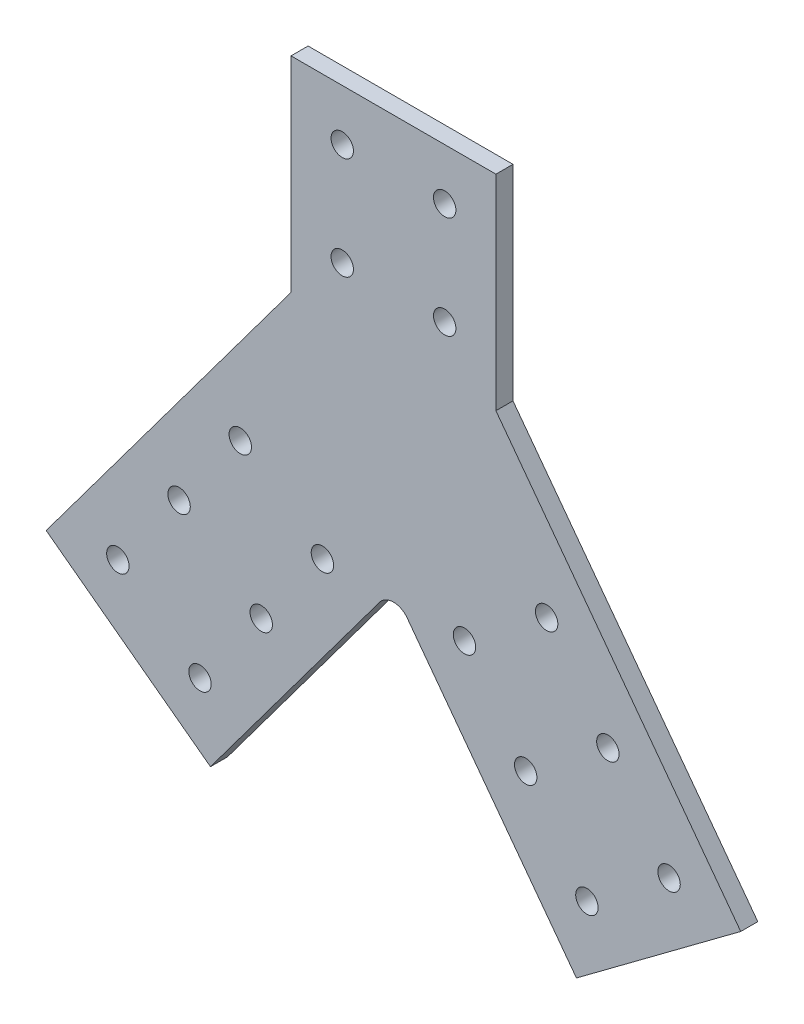
ISO-10303-21;
HEADER;
FILE_DESCRIPTION(('STEP AP214'),'2;1');
FILE_NAME('part.step','',(''),(''),'','','');
FILE_SCHEMA(('AUTOMOTIVE_DESIGN { 1 0 10303 214 1 1 1 1 }'));
ENDSEC;
DATA;
#1=APPLICATION_CONTEXT('core data for automotive mechanical design processes');
#2=APPLICATION_PROTOCOL_DEFINITION('international standard','automotive_design',2000,#1);
#3=PRODUCT_CONTEXT('',#1,'mechanical');
#4=PRODUCT('Part','Part','',(#3));
#5=PRODUCT_RELATED_PRODUCT_CATEGORY('part','',(#4));
#6=PRODUCT_DEFINITION_FORMATION('','',#4);
#7=PRODUCT_DEFINITION_CONTEXT('part definition',#1,'design');
#8=PRODUCT_DEFINITION('design','',#6,#7);
#9=PRODUCT_DEFINITION_SHAPE('','',#8);
#10=(LENGTH_UNIT() NAMED_UNIT(*) SI_UNIT(.MILLI.,.METRE.));
#11=(NAMED_UNIT(*) PLANE_ANGLE_UNIT() SI_UNIT($,.RADIAN.));
#12=(NAMED_UNIT(*) SI_UNIT($,.STERADIAN.) SOLID_ANGLE_UNIT());
#13=UNCERTAINTY_MEASURE_WITH_UNIT(LENGTH_MEASURE(1.E-05),#10,'distance_accuracy_value','');
#14=(GEOMETRIC_REPRESENTATION_CONTEXT(3) GLOBAL_UNCERTAINTY_ASSIGNED_CONTEXT((#13)) GLOBAL_UNIT_ASSIGNED_CONTEXT((#10,
#11,#12)) REPRESENTATION_CONTEXT('',''));
#15=CARTESIAN_POINT('',(0.,0.,0.));
#16=DIRECTION('',(0.,0.,1.));
#17=DIRECTION('',(1.,0.,0.));
#18=AXIS2_PLACEMENT_3D('',#15,#16,#17);
#19=CARTESIAN_POINT('',(0.,0.,6.35));
#20=DIRECTION('',(0.,0.,-1.));
#21=DIRECTION('',(-1.,0.,0.));
#22=AXIS2_PLACEMENT_3D('',#19,#20,#21);
#23=PLANE('',#22);
#24=CARTESIAN_POINT('',(64.5188408563899,-156.173717689386,6.35));
#25=DIRECTION('',(0.,0.,1.));
#26=DIRECTION('',(1.,0.,0.));
#27=AXIS2_PLACEMENT_3D('',#24,#25,#26);
#28=CIRCLE('',#27,4.167251);
#29=CARTESIAN_POINT('',(68.6860918563899,-156.173717689386,6.35));
#30=VERTEX_POINT('',#29);
#31=EDGE_CURVE('E301',#30,#30,#28,.T.);
#32=ORIENTED_EDGE('',*,*,#31,.F.);
#33=EDGE_LOOP('',(#32));
#34=FACE_BOUND('',#33,.T.);
#35=CARTESIAN_POINT('',(87.2830270383153,-186.725343300385,6.35));
#36=DIRECTION('',(0.,0.,1.));
#37=DIRECTION('',(1.,0.,0.));
#38=AXIS2_PLACEMENT_3D('',#35,#36,#37);
#39=CIRCLE('',#38,4.167251);
#40=CARTESIAN_POINT('',(91.4502780383153,-186.725343300385,6.35));
#41=VERTEX_POINT('',#40);
#42=EDGE_CURVE('E295',#41,#41,#39,.T.);
#43=ORIENTED_EDGE('',*,*,#42,.F.);
#44=EDGE_LOOP('',(#43));
#45=FACE_BOUND('',#44,.T.);
#46=CARTESIAN_POINT('',(95.0704664673887,-133.409531507461,6.35));
#47=DIRECTION('',(0.,0.,1.));
#48=DIRECTION('',(1.,0.,0.));
#49=AXIS2_PLACEMENT_3D('',#46,#47,#48);
#50=CIRCLE('',#49,4.167251);
#51=CARTESIAN_POINT('',(99.2377174673887,-133.409531507461,6.35));
#52=VERTEX_POINT('',#51);
#53=EDGE_CURVE('E283',#52,#52,#50,.T.);
#54=ORIENTED_EDGE('',*,*,#53,.F.);
#55=EDGE_LOOP('',(#54));
#56=FACE_BOUND('',#55,.T.);
#57=CARTESIAN_POINT('',(117.834652649314,-163.96115711846,6.35));
#58=DIRECTION('',(0.,0.,1.));
#59=DIRECTION('',(1.,0.,0.));
#60=AXIS2_PLACEMENT_3D('',#57,#58,#59);
#61=CIRCLE('',#60,4.167251);
#62=CARTESIAN_POINT('',(122.001903649314,-163.96115711846,6.35));
#63=VERTEX_POINT('',#62);
#64=EDGE_CURVE('E277',#63,#63,#61,.T.);
#65=ORIENTED_EDGE('',*,*,#64,.F.);
#66=EDGE_LOOP('',(#65));
#67=FACE_BOUND('',#66,.T.);
#68=CARTESIAN_POINT('',(140.59883883124,-194.512782729458,6.35));
#69=DIRECTION('',(0.,0.,1.));
#70=DIRECTION('',(1.,0.,0.));
#71=AXIS2_PLACEMENT_3D('',#68,#69,#70);
#72=CIRCLE('',#71,4.16725100000001);
#73=CARTESIAN_POINT('',(144.766089831239,-194.512782729458,6.35));
#74=VERTEX_POINT('',#73);
#75=EDGE_CURVE('E271',#74,#74,#72,.T.);
#76=ORIENTED_EDGE('',*,*,#75,.F.);
#77=EDGE_LOOP('',(#76));
#78=FACE_BOUND('',#77,.T.);
#79=CARTESIAN_POINT('',(-18.8704664673887,-133.409531507461,6.35));
#80=DIRECTION('',(0.,0.,1.));
#81=DIRECTION('',(1.,0.,0.));
#82=AXIS2_PLACEMENT_3D('',#79,#80,#81);
#83=CIRCLE('',#82,4.167251);
#84=CARTESIAN_POINT('',(-14.7032154673887,-133.409531507461,6.35));
#85=VERTEX_POINT('',#84);
#86=EDGE_CURVE('E247',#85,#85,#83,.T.);
#87=ORIENTED_EDGE('',*,*,#86,.F.);
#88=EDGE_LOOP('',(#87));
#89=FACE_BOUND('',#88,.T.);
#90=CARTESIAN_POINT('',(-41.634652649314,-163.96115711846,6.35));
#91=DIRECTION('',(0.,0.,1.));
#92=DIRECTION('',(1.,0.,0.));
#93=AXIS2_PLACEMENT_3D('',#90,#91,#92);
#94=CIRCLE('',#93,4.167251);
#95=CARTESIAN_POINT('',(-37.467401649314,-163.96115711846,6.35));
#96=VERTEX_POINT('',#95);
#97=EDGE_CURVE('E241',#96,#96,#94,.T.);
#98=ORIENTED_EDGE('',*,*,#97,.F.);
#99=EDGE_LOOP('',(#98));
#100=FACE_BOUND('',#99,.T.);
#101=CARTESIAN_POINT('',(-64.3988388312394,-194.512782729459,6.35));
#102=DIRECTION('',(0.,0.,1.));
#103=DIRECTION('',(1.,0.,0.));
#104=AXIS2_PLACEMENT_3D('',#101,#102,#103);
#105=CIRCLE('',#104,4.167251);
#106=CARTESIAN_POINT('',(-60.2315878312394,-194.512782729459,6.35));
#107=VERTEX_POINT('',#106);
#108=EDGE_CURVE('E235',#107,#107,#105,.T.);
#109=ORIENTED_EDGE('',*,*,#108,.F.);
#110=EDGE_LOOP('',(#109));
#111=FACE_BOUND('',#110,.T.);
#112=CARTESIAN_POINT('',(19.05,-19.05,6.35));
#113=DIRECTION('',(0.,0.,1.));
#114=DIRECTION('',(1.,0.,0.));
#115=AXIS2_PLACEMENT_3D('',#112,#113,#114);
#116=CIRCLE('',#115,4.167251);
#117=CARTESIAN_POINT('',(23.217251,-19.05,6.35));
#118=VERTEX_POINT('',#117);
#119=EDGE_CURVE('E226',#118,#118,#116,.T.);
#120=ORIENTED_EDGE('',*,*,#119,.F.);
#121=EDGE_LOOP('',(#120));
#122=FACE_BOUND('',#121,.T.);
#123=CARTESIAN_POINT('',(57.15,-19.05,6.35));
#124=DIRECTION('',(0.,0.,1.));
#125=DIRECTION('',(1.,0.,0.));
#126=AXIS2_PLACEMENT_3D('',#123,#124,#125);
#127=CIRCLE('',#126,4.167251);
#128=CARTESIAN_POINT('',(61.317251,-19.05,6.35));
#129=VERTEX_POINT('',#128);
#130=EDGE_CURVE('E223',#129,#129,#127,.T.);
#131=ORIENTED_EDGE('',*,*,#130,.F.);
#132=EDGE_LOOP('',(#131));
#133=FACE_BOUND('',#132,.T.);
#134=DIRECTION('',(0.,-1.,0.));
#135=VECTOR('',#134,1.);
#136=CARTESIAN_POINT('',(0.,-76.2,6.35));
#137=LINE('',#136,#135);
#138=CARTESIAN_POINT('',(0.,0.,6.35));
#139=VERTEX_POINT('',#138);
#140=CARTESIAN_POINT('',(0.,-76.2,6.35));
#141=VERTEX_POINT('',#140);
#142=EDGE_CURVE('E127',#139,#141,#137,.T.);
#143=ORIENTED_EDGE('',*,*,#142,.T.);
#144=DIRECTION('',(-0.597485201625338,-0.801879937296557,0.));
#145=VECTOR('',#144,1.);
#146=CARTESIAN_POINT('',(-91.0567447277015,-198.406502443995,6.35));
#147=LINE('',#146,#145);
#148=CARTESIAN_POINT('',(-91.0567447277015,-198.406502443995,6.35));
#149=VERTEX_POINT('',#148);
#150=EDGE_CURVE('E116',#141,#149,#147,.T.);
#151=ORIENTED_EDGE('',*,*,#150,.T.);
#152=DIRECTION('',(0.801879937296557,-0.597485201625337,0.));
#153=VECTOR('',#152,1.);
#154=CARTESIAN_POINT('',(-29.9534935057039,-243.934874807846,6.35));
#155=LINE('',#154,#153);
#156=CARTESIAN_POINT('',(-29.9534935057039,-243.934874807846,6.35));
#157=VERTEX_POINT('',#156);
#158=EDGE_CURVE('E126',#149,#157,#155,.T.);
#159=ORIENTED_EDGE('',*,*,#158,.T.);
#160=DIRECTION('',(0.597485201625337,0.801879937296557,0.));
#161=VECTOR('',#160,1.);
#162=CARTESIAN_POINT('',(38.1,-152.60084518382,6.35));
#163=LINE('',#162,#161);
#164=CARTESIAN_POINT('',(33.0080623981668,-159.434692438562,6.35));
#165=VERTEX_POINT('',#164);
#166=EDGE_CURVE('E203',#157,#165,#163,.T.);
#167=ORIENTED_EDGE('',*,*,#166,.T.);
#168=CARTESIAN_POINT('',(38.1,-163.228723468883,6.35));
#169=DIRECTION('',(0.,0.,-1.));
#170=DIRECTION('',(-1.,0.,0.));
#171=AXIS2_PLACEMENT_3D('',#168,#169,#170);
#172=CIRCLE('',#171,6.35);
#173=CARTESIAN_POINT('',(43.1919376018331,-159.434692438562,6.35));
#174=VERTEX_POINT('',#173);
#175=EDGE_CURVE('E11',#165,#174,#172,.T.);
#176=ORIENTED_EDGE('',*,*,#175,.T.);
#177=DIRECTION('',(0.597485201625339,-0.801879937296556,0.));
#178=VECTOR('',#177,1.);
#179=CARTESIAN_POINT('',(106.153493505704,-243.934874807846,6.35));
#180=LINE('',#179,#178);
#181=CARTESIAN_POINT('',(106.153493505704,-243.934874807846,6.35));
#182=VERTEX_POINT('',#181);
#183=EDGE_CURVE('E168',#174,#182,#180,.T.);
#184=ORIENTED_EDGE('',*,*,#183,.T.);
#185=DIRECTION('',(0.801879937296556,0.597485201625338,0.));
#186=VECTOR('',#185,1.);
#187=CARTESIAN_POINT('',(167.256744727702,-198.406502443995,6.35));
#188=LINE('',#187,#186);
#189=CARTESIAN_POINT('',(167.256744727702,-198.406502443995,6.35));
#190=VERTEX_POINT('',#189);
#191=EDGE_CURVE('E216',#182,#190,#188,.T.);
#192=ORIENTED_EDGE('',*,*,#191,.T.);
#193=DIRECTION('',(-0.597485201625338,0.801879937296556,0.));
#194=VECTOR('',#193,1.);
#195=CARTESIAN_POINT('',(76.2,-76.2,6.35));
#196=LINE('',#195,#194);
#197=CARTESIAN_POINT('',(76.2,-76.2,6.35));
#198=VERTEX_POINT('',#197);
#199=EDGE_CURVE('E214',#190,#198,#196,.T.);
#200=ORIENTED_EDGE('',*,*,#199,.T.);
#201=DIRECTION('',(0.,1.,0.));
#202=VECTOR('',#201,1.);
#203=CARTESIAN_POINT('',(76.2,0.,6.35));
#204=LINE('',#203,#202);
#205=CARTESIAN_POINT('',(76.2,0.,6.35));
#206=VERTEX_POINT('',#205);
#207=EDGE_CURVE('E212',#198,#206,#204,.T.);
#208=ORIENTED_EDGE('',*,*,#207,.T.);
#209=DIRECTION('',(-1.,0.,0.));
#210=VECTOR('',#209,1.);
#211=CARTESIAN_POINT('',(0.,0.,6.35));
#212=LINE('',#211,#210);
#213=EDGE_CURVE('E132',#206,#139,#212,.T.);
#214=ORIENTED_EDGE('',*,*,#213,.T.);
#215=EDGE_LOOP('',(#143,#151,#159,#167,#176,#184,#192,#200,#208,#214));
#216=FACE_BOUND('',#215,.T.);
#217=CARTESIAN_POINT('',(57.15,-57.15,6.35));
#218=DIRECTION('',(0.,0.,1.));
#219=DIRECTION('',(1.,0.,0.));
#220=AXIS2_PLACEMENT_3D('',#217,#218,#219);
#221=CIRCLE('',#220,4.167251);
#222=CARTESIAN_POINT('',(61.317251,-57.15,6.35));
#223=VERTEX_POINT('',#222);
#224=EDGE_CURVE('E144',#223,#223,#221,.T.);
#225=ORIENTED_EDGE('',*,*,#224,.F.);
#226=EDGE_LOOP('',(#225));
#227=FACE_BOUND('',#226,.T.);
#228=CARTESIAN_POINT('',(19.05,-57.15,6.35));
#229=DIRECTION('',(0.,0.,1.));
#230=DIRECTION('',(1.,0.,0.));
#231=AXIS2_PLACEMENT_3D('',#228,#229,#230);
#232=CIRCLE('',#231,4.167251);
#233=CARTESIAN_POINT('',(23.217251,-57.15,6.35));
#234=VERTEX_POINT('',#233);
#235=EDGE_CURVE('E155',#234,#234,#232,.T.);
#236=ORIENTED_EDGE('',*,*,#235,.F.);
#237=EDGE_LOOP('',(#236));
#238=FACE_BOUND('',#237,.T.);
#239=CARTESIAN_POINT('',(-33.8472132202406,-217.276968911384,6.35));
#240=DIRECTION('',(0.,0.,1.));
#241=DIRECTION('',(1.,0.,0.));
#242=AXIS2_PLACEMENT_3D('',#239,#240,#241);
#243=CIRCLE('',#242,4.167251);
#244=CARTESIAN_POINT('',(-29.6799622202406,-217.276968911384,6.35));
#245=VERTEX_POINT('',#244);
#246=EDGE_CURVE('E253',#245,#245,#243,.T.);
#247=ORIENTED_EDGE('',*,*,#246,.F.);
#248=EDGE_LOOP('',(#247));
#249=FACE_BOUND('',#248,.T.);
#250=CARTESIAN_POINT('',(-11.0830270383152,-186.725343300385,6.35));
#251=DIRECTION('',(0.,0.,1.));
#252=DIRECTION('',(1.,0.,0.));
#253=AXIS2_PLACEMENT_3D('',#250,#251,#252);
#254=CIRCLE('',#253,4.167251);
#255=CARTESIAN_POINT('',(-6.91577603831519,-186.725343300385,6.35));
#256=VERTEX_POINT('',#255);
#257=EDGE_CURVE('E259',#256,#256,#254,.T.);
#258=ORIENTED_EDGE('',*,*,#257,.F.);
#259=EDGE_LOOP('',(#258));
#260=FACE_BOUND('',#259,.T.);
#261=CARTESIAN_POINT('',(11.6811591436102,-156.173717689386,6.35));
#262=DIRECTION('',(0.,0.,1.));
#263=DIRECTION('',(1.,0.,0.));
#264=AXIS2_PLACEMENT_3D('',#261,#262,#263);
#265=CIRCLE('',#264,4.167251);
#266=CARTESIAN_POINT('',(15.8484101436102,-156.173717689386,6.35));
#267=VERTEX_POINT('',#266);
#268=EDGE_CURVE('E265',#267,#267,#265,.T.);
#269=ORIENTED_EDGE('',*,*,#268,.F.);
#270=EDGE_LOOP('',(#269));
#271=FACE_BOUND('',#270,.T.);
#272=CARTESIAN_POINT('',(110.047213220241,-217.276968911384,6.35));
#273=DIRECTION('',(0.,0.,1.));
#274=DIRECTION('',(1.,0.,0.));
#275=AXIS2_PLACEMENT_3D('',#272,#273,#274);
#276=CIRCLE('',#275,4.167251);
#277=CARTESIAN_POINT('',(114.214464220241,-217.276968911384,6.35));
#278=VERTEX_POINT('',#277);
#279=EDGE_CURVE('E289',#278,#278,#276,.T.);
#280=ORIENTED_EDGE('',*,*,#279,.F.);
#281=EDGE_LOOP('',(#280));
#282=FACE_BOUND('',#281,.T.);
#283=ADVANCED_FACE('F39',(#34,#45,#56,#67,#78,#89,#100,#111,#122,#133,#216,#227,#238,#249,#260,
#271,#282),#23,.F.);
#284=CARTESIAN_POINT('',(0.,0.,0.));
#285=DIRECTION('',(0.,0.,-1.));
#286=DIRECTION('',(-1.,0.,0.));
#287=AXIS2_PLACEMENT_3D('',#284,#285,#286);
#288=PLANE('',#287);
#289=CARTESIAN_POINT('',(64.5188408563899,-156.173717689386,0.));
#290=DIRECTION('',(0.,0.,1.));
#291=DIRECTION('',(1.,0.,0.));
#292=AXIS2_PLACEMENT_3D('',#289,#290,#291);
#293=CIRCLE('',#292,4.167251);
#294=CARTESIAN_POINT('',(68.6860918563899,-156.173717689386,0.));
#295=VERTEX_POINT('',#294);
#296=EDGE_CURVE('E298',#295,#295,#293,.T.);
#297=ORIENTED_EDGE('',*,*,#296,.T.);
#298=EDGE_LOOP('',(#297));
#299=FACE_BOUND('',#298,.T.);
#300=CARTESIAN_POINT('',(87.2830270383153,-186.725343300385,0.));
#301=DIRECTION('',(0.,0.,1.));
#302=DIRECTION('',(1.,0.,0.));
#303=AXIS2_PLACEMENT_3D('',#300,#301,#302);
#304=CIRCLE('',#303,4.167251);
#305=CARTESIAN_POINT('',(91.4502780383153,-186.725343300385,0.));
#306=VERTEX_POINT('',#305);
#307=EDGE_CURVE('E292',#306,#306,#304,.T.);
#308=ORIENTED_EDGE('',*,*,#307,.T.);
#309=EDGE_LOOP('',(#308));
#310=FACE_BOUND('',#309,.T.);
#311=CARTESIAN_POINT('',(140.59883883124,-194.512782729458,0.));
#312=DIRECTION('',(0.,0.,1.));
#313=DIRECTION('',(1.,0.,0.));
#314=AXIS2_PLACEMENT_3D('',#311,#312,#313);
#315=CIRCLE('',#314,4.16725100000001);
#316=CARTESIAN_POINT('',(144.766089831239,-194.512782729458,0.));
#317=VERTEX_POINT('',#316);
#318=EDGE_CURVE('E268',#317,#317,#315,.T.);
#319=ORIENTED_EDGE('',*,*,#318,.T.);
#320=EDGE_LOOP('',(#319));
#321=FACE_BOUND('',#320,.T.);
#322=CARTESIAN_POINT('',(-33.8472132202406,-217.276968911384,0.));
#323=DIRECTION('',(0.,0.,1.));
#324=DIRECTION('',(1.,0.,0.));
#325=AXIS2_PLACEMENT_3D('',#322,#323,#324);
#326=CIRCLE('',#325,4.167251);
#327=CARTESIAN_POINT('',(-29.6799622202406,-217.276968911384,0.));
#328=VERTEX_POINT('',#327);
#329=EDGE_CURVE('E250',#328,#328,#326,.T.);
#330=ORIENTED_EDGE('',*,*,#329,.T.);
#331=EDGE_LOOP('',(#330));
#332=FACE_BOUND('',#331,.T.);
#333=CARTESIAN_POINT('',(-18.8704664673887,-133.409531507461,0.));
#334=DIRECTION('',(0.,0.,1.));
#335=DIRECTION('',(1.,0.,0.));
#336=AXIS2_PLACEMENT_3D('',#333,#334,#335);
#337=CIRCLE('',#336,4.167251);
#338=CARTESIAN_POINT('',(-14.7032154673887,-133.409531507461,0.));
#339=VERTEX_POINT('',#338);
#340=EDGE_CURVE('E244',#339,#339,#337,.T.);
#341=ORIENTED_EDGE('',*,*,#340,.T.);
#342=EDGE_LOOP('',(#341));
#343=FACE_BOUND('',#342,.T.);
#344=CARTESIAN_POINT('',(-41.634652649314,-163.96115711846,0.));
#345=DIRECTION('',(0.,0.,1.));
#346=DIRECTION('',(1.,0.,0.));
#347=AXIS2_PLACEMENT_3D('',#344,#345,#346);
#348=CIRCLE('',#347,4.167251);
#349=CARTESIAN_POINT('',(-37.467401649314,-163.96115711846,0.));
#350=VERTEX_POINT('',#349);
#351=EDGE_CURVE('E238',#350,#350,#348,.T.);
#352=ORIENTED_EDGE('',*,*,#351,.T.);
#353=EDGE_LOOP('',(#352));
#354=FACE_BOUND('',#353,.T.);
#355=CARTESIAN_POINT('',(-64.3988388312394,-194.512782729459,0.));
#356=DIRECTION('',(0.,0.,1.));
#357=DIRECTION('',(1.,0.,0.));
#358=AXIS2_PLACEMENT_3D('',#355,#356,#357);
#359=CIRCLE('',#358,4.167251);
#360=CARTESIAN_POINT('',(-60.2315878312394,-194.512782729459,0.));
#361=VERTEX_POINT('',#360);
#362=EDGE_CURVE('E232',#361,#361,#359,.T.);
#363=ORIENTED_EDGE('',*,*,#362,.T.);
#364=EDGE_LOOP('',(#363));
#365=FACE_BOUND('',#364,.T.);
#366=CARTESIAN_POINT('',(19.05,-19.05,0.));
#367=DIRECTION('',(0.,0.,1.));
#368=DIRECTION('',(1.,0.,0.));
#369=AXIS2_PLACEMENT_3D('',#366,#367,#368);
#370=CIRCLE('',#369,4.167251);
#371=CARTESIAN_POINT('',(23.217251,-19.05,0.));
#372=VERTEX_POINT('',#371);
#373=EDGE_CURVE('E229',#372,#372,#370,.T.);
#374=ORIENTED_EDGE('',*,*,#373,.T.);
#375=EDGE_LOOP('',(#374));
#376=FACE_BOUND('',#375,.T.);
#377=CARTESIAN_POINT('',(57.15,-19.05,0.));
#378=DIRECTION('',(0.,0.,1.));
#379=DIRECTION('',(1.,0.,0.));
#380=AXIS2_PLACEMENT_3D('',#377,#378,#379);
#381=CIRCLE('',#380,4.167251);
#382=CARTESIAN_POINT('',(61.317251,-19.05,0.));
#383=VERTEX_POINT('',#382);
#384=EDGE_CURVE('E210',#383,#383,#381,.T.);
#385=ORIENTED_EDGE('',*,*,#384,.T.);
#386=EDGE_LOOP('',(#385));
#387=FACE_BOUND('',#386,.T.);
#388=DIRECTION('',(0.,-1.,0.));
#389=VECTOR('',#388,1.);
#390=CARTESIAN_POINT('',(0.,-76.2,0.));
#391=LINE('',#390,#389);
#392=CARTESIAN_POINT('',(0.,0.,0.));
#393=VERTEX_POINT('',#392);
#394=CARTESIAN_POINT('',(0.,-76.2,0.));
#395=VERTEX_POINT('',#394);
#396=EDGE_CURVE('E140',#393,#395,#391,.T.);
#397=ORIENTED_EDGE('',*,*,#396,.F.);
#398=DIRECTION('',(-1.,0.,0.));
#399=VECTOR('',#398,1.);
#400=CARTESIAN_POINT('',(0.,0.,0.));
#401=LINE('',#400,#399);
#402=CARTESIAN_POINT('',(76.2,0.,0.));
#403=VERTEX_POINT('',#402);
#404=EDGE_CURVE('E136',#403,#393,#401,.T.);
#405=ORIENTED_EDGE('',*,*,#404,.F.);
#406=DIRECTION('',(0.,1.,0.));
#407=VECTOR('',#406,1.);
#408=CARTESIAN_POINT('',(76.2,0.,0.));
#409=LINE('',#408,#407);
#410=CARTESIAN_POINT('',(76.2,-76.2,0.));
#411=VERTEX_POINT('',#410);
#412=EDGE_CURVE('E185',#411,#403,#409,.T.);
#413=ORIENTED_EDGE('',*,*,#412,.F.);
#414=DIRECTION('',(-0.597485201625338,0.801879937296556,0.));
#415=VECTOR('',#414,1.);
#416=CARTESIAN_POINT('',(76.2,-76.2,0.));
#417=LINE('',#416,#415);
#418=CARTESIAN_POINT('',(167.256744727702,-198.406502443995,0.));
#419=VERTEX_POINT('',#418);
#420=EDGE_CURVE('E178',#419,#411,#417,.T.);
#421=ORIENTED_EDGE('',*,*,#420,.F.);
#422=DIRECTION('',(0.801879937296556,0.597485201625338,0.));
#423=VECTOR('',#422,1.);
#424=CARTESIAN_POINT('',(167.256744727702,-198.406502443995,0.));
#425=LINE('',#424,#423);
#426=CARTESIAN_POINT('',(106.153493505704,-243.934874807846,0.));
#427=VERTEX_POINT('',#426);
#428=EDGE_CURVE('E175',#427,#419,#425,.T.);
#429=ORIENTED_EDGE('',*,*,#428,.F.);
#430=DIRECTION('',(0.597485201625339,-0.801879937296556,0.));
#431=VECTOR('',#430,1.);
#432=CARTESIAN_POINT('',(106.153493505704,-243.934874807846,0.));
#433=LINE('',#432,#431);
#434=CARTESIAN_POINT('',(43.1919376018331,-159.434692438562,0.));
#435=VERTEX_POINT('',#434);
#436=EDGE_CURVE('E166',#435,#427,#433,.T.);
#437=ORIENTED_EDGE('',*,*,#436,.F.);
#438=CARTESIAN_POINT('',(38.1,-163.228723468883,0.));
#439=DIRECTION('',(0.,0.,-1.));
#440=DIRECTION('',(-1.,0.,0.));
#441=AXIS2_PLACEMENT_3D('',#438,#439,#440);
#442=CIRCLE('',#441,6.35);
#443=CARTESIAN_POINT('',(33.0080623981668,-159.434692438562,0.));
#444=VERTEX_POINT('',#443);
#445=EDGE_CURVE('E47',#435,#444,#442,.F.);
#446=ORIENTED_EDGE('',*,*,#445,.T.);
#447=DIRECTION('',(0.597485201625337,0.801879937296557,0.));
#448=VECTOR('',#447,1.);
#449=CARTESIAN_POINT('',(38.1,-152.60084518382,0.));
#450=LINE('',#449,#448);
#451=CARTESIAN_POINT('',(-29.9534935057039,-243.934874807846,0.));
#452=VERTEX_POINT('',#451);
#453=EDGE_CURVE('E176',#452,#444,#450,.T.);
#454=ORIENTED_EDGE('',*,*,#453,.F.);
#455=DIRECTION('',(0.801879937296557,-0.597485201625337,0.));
#456=VECTOR('',#455,1.);
#457=CARTESIAN_POINT('',(-29.9534935057039,-243.934874807846,0.));
#458=LINE('',#457,#456);
#459=CARTESIAN_POINT('',(-91.0567447277015,-198.406502443995,0.));
#460=VERTEX_POINT('',#459);
#461=EDGE_CURVE('E180',#460,#452,#458,.T.);
#462=ORIENTED_EDGE('',*,*,#461,.F.);
#463=DIRECTION('',(-0.597485201625338,-0.801879937296557,0.));
#464=VECTOR('',#463,1.);
#465=CARTESIAN_POINT('',(-91.0567447277015,-198.406502443995,0.));
#466=LINE('',#465,#464);
#467=EDGE_CURVE('E206',#395,#460,#466,.T.);
#468=ORIENTED_EDGE('',*,*,#467,.F.);
#469=EDGE_LOOP('',(#397,#405,#413,#421,#429,#437,#446,#454,#462,#468));
#470=FACE_BOUND('',#469,.T.);
#471=CARTESIAN_POINT('',(57.15,-57.15,0.));
#472=DIRECTION('',(0.,0.,1.));
#473=DIRECTION('',(1.,0.,0.));
#474=AXIS2_PLACEMENT_3D('',#471,#472,#473);
#475=CIRCLE('',#474,4.167251);
#476=CARTESIAN_POINT('',(61.317251,-57.15,0.));
#477=VERTEX_POINT('',#476);
#478=EDGE_CURVE('E141',#477,#477,#475,.T.);
#479=ORIENTED_EDGE('',*,*,#478,.T.);
#480=EDGE_LOOP('',(#479));
#481=FACE_BOUND('',#480,.T.);
#482=CARTESIAN_POINT('',(19.05,-57.15,0.));
#483=DIRECTION('',(0.,0.,1.));
#484=DIRECTION('',(1.,0.,0.));
#485=AXIS2_PLACEMENT_3D('',#482,#483,#484);
#486=CIRCLE('',#485,4.167251);
#487=CARTESIAN_POINT('',(23.217251,-57.15,0.));
#488=VERTEX_POINT('',#487);
#489=EDGE_CURVE('E152',#488,#488,#486,.T.);
#490=ORIENTED_EDGE('',*,*,#489,.T.);
#491=EDGE_LOOP('',(#490));
#492=FACE_BOUND('',#491,.T.);
#493=CARTESIAN_POINT('',(-11.0830270383152,-186.725343300385,0.));
#494=DIRECTION('',(0.,0.,1.));
#495=DIRECTION('',(1.,0.,0.));
#496=AXIS2_PLACEMENT_3D('',#493,#494,#495);
#497=CIRCLE('',#496,4.167251);
#498=CARTESIAN_POINT('',(-6.9157760383152,-186.725343300385,0.));
#499=VERTEX_POINT('',#498);
#500=EDGE_CURVE('E256',#499,#499,#497,.T.);
#501=ORIENTED_EDGE('',*,*,#500,.T.);
#502=EDGE_LOOP('',(#501));
#503=FACE_BOUND('',#502,.T.);
#504=CARTESIAN_POINT('',(11.6811591436102,-156.173717689386,0.));
#505=DIRECTION('',(0.,0.,1.));
#506=DIRECTION('',(1.,0.,0.));
#507=AXIS2_PLACEMENT_3D('',#504,#505,#506);
#508=CIRCLE('',#507,4.167251);
#509=CARTESIAN_POINT('',(15.8484101436102,-156.173717689386,0.));
#510=VERTEX_POINT('',#509);
#511=EDGE_CURVE('E262',#510,#510,#508,.T.);
#512=ORIENTED_EDGE('',*,*,#511,.T.);
#513=EDGE_LOOP('',(#512));
#514=FACE_BOUND('',#513,.T.);
#515=CARTESIAN_POINT('',(117.834652649314,-163.96115711846,0.));
#516=DIRECTION('',(0.,0.,1.));
#517=DIRECTION('',(1.,0.,0.));
#518=AXIS2_PLACEMENT_3D('',#515,#516,#517);
#519=CIRCLE('',#518,4.167251);
#520=CARTESIAN_POINT('',(122.001903649314,-163.96115711846,0.));
#521=VERTEX_POINT('',#520);
#522=EDGE_CURVE('E274',#521,#521,#519,.T.);
#523=ORIENTED_EDGE('',*,*,#522,.T.);
#524=EDGE_LOOP('',(#523));
#525=FACE_BOUND('',#524,.T.);
#526=CARTESIAN_POINT('',(95.0704664673887,-133.409531507461,0.));
#527=DIRECTION('',(0.,0.,1.));
#528=DIRECTION('',(1.,0.,0.));
#529=AXIS2_PLACEMENT_3D('',#526,#527,#528);
#530=CIRCLE('',#529,4.167251);
#531=CARTESIAN_POINT('',(99.2377174673887,-133.409531507461,0.));
#532=VERTEX_POINT('',#531);
#533=EDGE_CURVE('E280',#532,#532,#530,.T.);
#534=ORIENTED_EDGE('',*,*,#533,.T.);
#535=EDGE_LOOP('',(#534));
#536=FACE_BOUND('',#535,.T.);
#537=CARTESIAN_POINT('',(110.047213220241,-217.276968911384,0.));
#538=DIRECTION('',(0.,0.,1.));
#539=DIRECTION('',(1.,0.,0.));
#540=AXIS2_PLACEMENT_3D('',#537,#538,#539);
#541=CIRCLE('',#540,4.167251);
#542=CARTESIAN_POINT('',(114.214464220241,-217.276968911384,0.));
#543=VERTEX_POINT('',#542);
#544=EDGE_CURVE('E286',#543,#543,#541,.T.);
#545=ORIENTED_EDGE('',*,*,#544,.T.);
#546=EDGE_LOOP('',(#545));
#547=FACE_BOUND('',#546,.T.);
#548=ADVANCED_FACE('F172',(#299,#310,#321,#332,#343,#354,#365,#376,#387,#470,#481,#492,#503,
#514,#525,#536,#547),#288,.T.);
#549=CARTESIAN_POINT('',(19.05,-57.15,6.35));
#550=DIRECTION('',(0.,0.,1.));
#551=DIRECTION('',(1.,0.,0.));
#552=AXIS2_PLACEMENT_3D('',#549,#550,#551);
#553=CYLINDRICAL_SURFACE('',#552,4.167251);
#554=ORIENTED_EDGE('',*,*,#489,.F.);
#555=EDGE_LOOP('',(#554));
#556=FACE_BOUND('',#555,.T.);
#557=ORIENTED_EDGE('',*,*,#235,.T.);
#558=EDGE_LOOP('',(#557));
#559=FACE_BOUND('',#558,.T.);
#560=ADVANCED_FACE('F349',(#556,#559),#553,.F.);
#561=CARTESIAN_POINT('',(57.15,-57.15,6.35));
#562=DIRECTION('',(0.,0.,1.));
#563=DIRECTION('',(1.,0.,0.));
#564=AXIS2_PLACEMENT_3D('',#561,#562,#563);
#565=CYLINDRICAL_SURFACE('',#564,4.167251);
#566=ORIENTED_EDGE('',*,*,#478,.F.);
#567=EDGE_LOOP('',(#566));
#568=FACE_BOUND('',#567,.T.);
#569=ORIENTED_EDGE('',*,*,#224,.T.);
#570=EDGE_LOOP('',(#569));
#571=FACE_BOUND('',#570,.T.);
#572=ADVANCED_FACE('F374',(#568,#571),#565,.F.);
#573=CARTESIAN_POINT('',(0.,-76.2,6.35));
#574=DIRECTION('',(1.,0.,0.));
#575=DIRECTION('',(0.,1.,0.));
#576=AXIS2_PLACEMENT_3D('',#573,#574,#575);
#577=PLANE('',#576);
#578=ORIENTED_EDGE('',*,*,#396,.T.);
#579=DIRECTION('',(0.,0.,-1.));
#580=VECTOR('',#579,1.);
#581=CARTESIAN_POINT('',(0.,-76.2,6.35));
#582=LINE('',#581,#580);
#583=EDGE_CURVE('E120',#141,#395,#582,.T.);
#584=ORIENTED_EDGE('',*,*,#583,.F.);
#585=ORIENTED_EDGE('',*,*,#142,.F.);
#586=DIRECTION('',(0.,0.,-1.));
#587=VECTOR('',#586,1.);
#588=CARTESIAN_POINT('',(0.,0.,6.35));
#589=LINE('',#588,#587);
#590=EDGE_CURVE('E188',#139,#393,#589,.T.);
#591=ORIENTED_EDGE('',*,*,#590,.T.);
#592=EDGE_LOOP('',(#578,#584,#585,#591));
#593=FACE_BOUND('',#592,.T.);
#594=ADVANCED_FACE('F138',(#593),#577,.F.);
#595=CARTESIAN_POINT('',(-91.0567447277015,-198.406502443995,6.35));
#596=DIRECTION('',(0.801879937296557,-0.597485201625338,0.));
#597=DIRECTION('',(0.597485201625338,0.801879937296557,0.));
#598=AXIS2_PLACEMENT_3D('',#595,#596,#597);
#599=PLANE('',#598);
#600=ORIENTED_EDGE('',*,*,#467,.T.);
#601=DIRECTION('',(0.,0.,-1.));
#602=VECTOR('',#601,1.);
#603=CARTESIAN_POINT('',(-91.0567447277015,-198.406502443995,6.35));
#604=LINE('',#603,#602);
#605=EDGE_CURVE('E123',#149,#460,#604,.T.);
#606=ORIENTED_EDGE('',*,*,#605,.F.);
#607=ORIENTED_EDGE('',*,*,#150,.F.);
#608=ORIENTED_EDGE('',*,*,#583,.T.);
#609=EDGE_LOOP('',(#600,#606,#607,#608));
#610=FACE_BOUND('',#609,.T.);
#611=ADVANCED_FACE('F118',(#610),#599,.F.);
#612=CARTESIAN_POINT('',(-29.9534935057039,-243.934874807846,6.35));
#613=DIRECTION('',(0.597485201625337,0.801879937296557,0.));
#614=DIRECTION('',(-0.801879937296557,0.597485201625337,0.));
#615=AXIS2_PLACEMENT_3D('',#612,#613,#614);
#616=PLANE('',#615);
#617=ORIENTED_EDGE('',*,*,#461,.T.);
#618=DIRECTION('',(0.,0.,-1.));
#619=VECTOR('',#618,1.);
#620=CARTESIAN_POINT('',(-29.9534935057039,-243.934874807846,6.35));
#621=LINE('',#620,#619);
#622=EDGE_CURVE('E146',#157,#452,#621,.T.);
#623=ORIENTED_EDGE('',*,*,#622,.F.);
#624=ORIENTED_EDGE('',*,*,#158,.F.);
#625=ORIENTED_EDGE('',*,*,#605,.T.);
#626=EDGE_LOOP('',(#617,#623,#624,#625));
#627=FACE_BOUND('',#626,.T.);
#628=ADVANCED_FACE('F367',(#627),#616,.F.);
#629=CARTESIAN_POINT('',(38.1,-152.60084518382,6.35));
#630=DIRECTION('',(-0.801879937296557,0.597485201625337,0.));
#631=DIRECTION('',(-0.597485201625337,-0.801879937296557,0.));
#632=AXIS2_PLACEMENT_3D('',#629,#630,#631);
#633=PLANE('',#632);
#634=ORIENTED_EDGE('',*,*,#453,.T.);
#635=DIRECTION('',(0.,0.,-1.));
#636=VECTOR('',#635,1.);
#637=CARTESIAN_POINT('',(33.0080623981668,-159.434692438562,6.35));
#638=LINE('',#637,#636);
#639=EDGE_CURVE('E54',#444,#165,#638,.F.);
#640=ORIENTED_EDGE('',*,*,#639,.T.);
#641=ORIENTED_EDGE('',*,*,#166,.F.);
#642=ORIENTED_EDGE('',*,*,#622,.T.);
#643=EDGE_LOOP('',(#634,#640,#641,#642));
#644=FACE_BOUND('',#643,.T.);
#645=ADVANCED_FACE('F202',(#644),#633,.F.);
#646=CARTESIAN_POINT('',(106.153493505704,-243.934874807846,6.35));
#647=DIRECTION('',(0.801879937296556,0.597485201625339,0.));
#648=DIRECTION('',(-0.597485201625339,0.801879937296556,0.));
#649=AXIS2_PLACEMENT_3D('',#646,#647,#648);
#650=PLANE('',#649);
#651=ORIENTED_EDGE('',*,*,#183,.F.);
#652=DIRECTION('',(0.,0.,-1.));
#653=VECTOR('',#652,1.);
#654=CARTESIAN_POINT('',(43.1919376018331,-159.434692438562,0.));
#655=LINE('',#654,#653);
#656=EDGE_CURVE('E158',#174,#435,#655,.T.);
#657=ORIENTED_EDGE('',*,*,#656,.T.);
#658=ORIENTED_EDGE('',*,*,#436,.T.);
#659=DIRECTION('',(0.,0.,-1.));
#660=VECTOR('',#659,1.);
#661=CARTESIAN_POINT('',(106.153493505704,-243.934874807846,6.35));
#662=LINE('',#661,#660);
#663=EDGE_CURVE('E199',#182,#427,#662,.T.);
#664=ORIENTED_EDGE('',*,*,#663,.F.);
#665=EDGE_LOOP('',(#651,#657,#658,#664));
#666=FACE_BOUND('',#665,.T.);
#667=ADVANCED_FACE('F164',(#666),#650,.F.);
#668=CARTESIAN_POINT('',(167.256744727702,-198.406502443995,6.35));
#669=DIRECTION('',(-0.597485201625338,0.801879937296556,0.));
#670=DIRECTION('',(-0.801879937296556,-0.597485201625338,0.));
#671=AXIS2_PLACEMENT_3D('',#668,#669,#670);
#672=PLANE('',#671);
#673=ORIENTED_EDGE('',*,*,#428,.T.);
#674=DIRECTION('',(0.,0.,-1.));
#675=VECTOR('',#674,1.);
#676=CARTESIAN_POINT('',(167.256744727702,-198.406502443995,6.35));
#677=LINE('',#676,#675);
#678=EDGE_CURVE('E196',#190,#419,#677,.T.);
#679=ORIENTED_EDGE('',*,*,#678,.F.);
#680=ORIENTED_EDGE('',*,*,#191,.F.);
#681=ORIENTED_EDGE('',*,*,#663,.T.);
#682=EDGE_LOOP('',(#673,#679,#680,#681));
#683=FACE_BOUND('',#682,.T.);
#684=ADVANCED_FACE('F358',(#683),#672,.F.);
#685=CARTESIAN_POINT('',(76.2,-76.2,6.35));
#686=DIRECTION('',(-0.801879937296556,-0.597485201625338,0.));
#687=DIRECTION('',(0.597485201625338,-0.801879937296556,0.));
#688=AXIS2_PLACEMENT_3D('',#685,#686,#687);
#689=PLANE('',#688);
#690=ORIENTED_EDGE('',*,*,#420,.T.);
#691=DIRECTION('',(0.,0.,-1.));
#692=VECTOR('',#691,1.);
#693=CARTESIAN_POINT('',(76.2,-76.2,6.35));
#694=LINE('',#693,#692);
#695=EDGE_CURVE('E193',#198,#411,#694,.T.);
#696=ORIENTED_EDGE('',*,*,#695,.F.);
#697=ORIENTED_EDGE('',*,*,#199,.F.);
#698=ORIENTED_EDGE('',*,*,#678,.T.);
#699=EDGE_LOOP('',(#690,#696,#697,#698));
#700=FACE_BOUND('',#699,.T.);
#701=ADVANCED_FACE('F354',(#700),#689,.F.);
#702=CARTESIAN_POINT('',(76.2,0.,6.35));
#703=DIRECTION('',(-1.,0.,0.));
#704=DIRECTION('',(0.,-1.,0.));
#705=AXIS2_PLACEMENT_3D('',#702,#703,#704);
#706=PLANE('',#705);
#707=ORIENTED_EDGE('',*,*,#412,.T.);
#708=DIRECTION('',(0.,0.,-1.));
#709=VECTOR('',#708,1.);
#710=CARTESIAN_POINT('',(76.2,0.,6.35));
#711=LINE('',#710,#709);
#712=EDGE_CURVE('E190',#206,#403,#711,.T.);
#713=ORIENTED_EDGE('',*,*,#712,.F.);
#714=ORIENTED_EDGE('',*,*,#207,.F.);
#715=ORIENTED_EDGE('',*,*,#695,.T.);
#716=EDGE_LOOP('',(#707,#713,#714,#715));
#717=FACE_BOUND('',#716,.T.);
#718=ADVANCED_FACE('F342',(#717),#706,.F.);
#719=CARTESIAN_POINT('',(0.,0.,6.35));
#720=DIRECTION('',(0.,-1.,0.));
#721=DIRECTION('',(0.,0.,-1.));
#722=AXIS2_PLACEMENT_3D('',#719,#720,#721);
#723=PLANE('',#722);
#724=ORIENTED_EDGE('',*,*,#404,.T.);
#725=ORIENTED_EDGE('',*,*,#590,.F.);
#726=ORIENTED_EDGE('',*,*,#213,.F.);
#727=ORIENTED_EDGE('',*,*,#712,.T.);
#728=EDGE_LOOP('',(#724,#725,#726,#727));
#729=FACE_BOUND('',#728,.T.);
#730=ADVANCED_FACE('F331',(#729),#723,.F.);
#731=CARTESIAN_POINT('',(57.15,-19.05,6.35));
#732=DIRECTION('',(0.,0.,1.));
#733=DIRECTION('',(1.,0.,0.));
#734=AXIS2_PLACEMENT_3D('',#731,#732,#733);
#735=CYLINDRICAL_SURFACE('',#734,4.167251);
#736=ORIENTED_EDGE('',*,*,#384,.F.);
#737=EDGE_LOOP('',(#736));
#738=FACE_BOUND('',#737,.T.);
#739=ORIENTED_EDGE('',*,*,#130,.T.);
#740=EDGE_LOOP('',(#739));
#741=FACE_BOUND('',#740,.T.);
#742=ADVANCED_FACE('F328',(#738,#741),#735,.F.);
#743=CARTESIAN_POINT('',(19.05,-19.05,6.35));
#744=DIRECTION('',(0.,0.,1.));
#745=DIRECTION('',(1.,0.,0.));
#746=AXIS2_PLACEMENT_3D('',#743,#744,#745);
#747=CYLINDRICAL_SURFACE('',#746,4.167251);
#748=ORIENTED_EDGE('',*,*,#373,.F.);
#749=EDGE_LOOP('',(#748));
#750=FACE_BOUND('',#749,.T.);
#751=ORIENTED_EDGE('',*,*,#119,.T.);
#752=EDGE_LOOP('',(#751));
#753=FACE_BOUND('',#752,.T.);
#754=ADVANCED_FACE('F330',(#750,#753),#747,.F.);
#755=CARTESIAN_POINT('',(-64.3988388312394,-194.512782729459,6.35));
#756=DIRECTION('',(0.,0.,1.));
#757=DIRECTION('',(1.,0.,0.));
#758=AXIS2_PLACEMENT_3D('',#755,#756,#757);
#759=CYLINDRICAL_SURFACE('',#758,4.167251);
#760=ORIENTED_EDGE('',*,*,#362,.F.);
#761=EDGE_LOOP('',(#760));
#762=FACE_BOUND('',#761,.T.);
#763=ORIENTED_EDGE('',*,*,#108,.T.);
#764=EDGE_LOOP('',(#763));
#765=FACE_BOUND('',#764,.T.);
#766=ADVANCED_FACE('F339',(#762,#765),#759,.F.);
#767=CARTESIAN_POINT('',(-41.634652649314,-163.96115711846,6.35));
#768=DIRECTION('',(0.,0.,1.));
#769=DIRECTION('',(1.,0.,0.));
#770=AXIS2_PLACEMENT_3D('',#767,#768,#769);
#771=CYLINDRICAL_SURFACE('',#770,4.167251);
#772=ORIENTED_EDGE('',*,*,#351,.F.);
#773=EDGE_LOOP('',(#772));
#774=FACE_BOUND('',#773,.T.);
#775=ORIENTED_EDGE('',*,*,#97,.T.);
#776=EDGE_LOOP('',(#775));
#777=FACE_BOUND('',#776,.T.);
#778=ADVANCED_FACE('F433',(#774,#777),#771,.F.);
#779=CARTESIAN_POINT('',(-18.8704664673887,-133.409531507461,6.35));
#780=DIRECTION('',(0.,0.,1.));
#781=DIRECTION('',(1.,0.,0.));
#782=AXIS2_PLACEMENT_3D('',#779,#780,#781);
#783=CYLINDRICAL_SURFACE('',#782,4.167251);
#784=ORIENTED_EDGE('',*,*,#340,.F.);
#785=EDGE_LOOP('',(#784));
#786=FACE_BOUND('',#785,.T.);
#787=ORIENTED_EDGE('',*,*,#86,.T.);
#788=EDGE_LOOP('',(#787));
#789=FACE_BOUND('',#788,.T.);
#790=ADVANCED_FACE('F429',(#786,#789),#783,.F.);
#791=CARTESIAN_POINT('',(-33.8472132202406,-217.276968911384,6.35));
#792=DIRECTION('',(0.,0.,1.));
#793=DIRECTION('',(1.,0.,0.));
#794=AXIS2_PLACEMENT_3D('',#791,#792,#793);
#795=CYLINDRICAL_SURFACE('',#794,4.167251);
#796=ORIENTED_EDGE('',*,*,#329,.F.);
#797=EDGE_LOOP('',(#796));
#798=FACE_BOUND('',#797,.T.);
#799=ORIENTED_EDGE('',*,*,#246,.T.);
#800=EDGE_LOOP('',(#799));
#801=FACE_BOUND('',#800,.T.);
#802=ADVANCED_FACE('F425',(#798,#801),#795,.F.);
#803=CARTESIAN_POINT('',(-11.0830270383152,-186.725343300385,6.35));
#804=DIRECTION('',(0.,0.,1.));
#805=DIRECTION('',(1.,0.,0.));
#806=AXIS2_PLACEMENT_3D('',#803,#804,#805);
#807=CYLINDRICAL_SURFACE('',#806,4.167251);
#808=ORIENTED_EDGE('',*,*,#500,.F.);
#809=EDGE_LOOP('',(#808));
#810=FACE_BOUND('',#809,.T.);
#811=ORIENTED_EDGE('',*,*,#257,.T.);
#812=EDGE_LOOP('',(#811));
#813=FACE_BOUND('',#812,.T.);
#814=ADVANCED_FACE('F421',(#810,#813),#807,.F.);
#815=CARTESIAN_POINT('',(11.6811591436102,-156.173717689386,6.35));
#816=DIRECTION('',(0.,0.,1.));
#817=DIRECTION('',(1.,0.,0.));
#818=AXIS2_PLACEMENT_3D('',#815,#816,#817);
#819=CYLINDRICAL_SURFACE('',#818,4.167251);
#820=ORIENTED_EDGE('',*,*,#511,.F.);
#821=EDGE_LOOP('',(#820));
#822=FACE_BOUND('',#821,.T.);
#823=ORIENTED_EDGE('',*,*,#268,.T.);
#824=EDGE_LOOP('',(#823));
#825=FACE_BOUND('',#824,.T.);
#826=ADVANCED_FACE('F417',(#822,#825),#819,.F.);
#827=CARTESIAN_POINT('',(140.59883883124,-194.512782729458,6.35));
#828=DIRECTION('',(0.,0.,1.));
#829=DIRECTION('',(1.,0.,0.));
#830=AXIS2_PLACEMENT_3D('',#827,#828,#829);
#831=CYLINDRICAL_SURFACE('',#830,4.16725100000001);
#832=ORIENTED_EDGE('',*,*,#318,.F.);
#833=EDGE_LOOP('',(#832));
#834=FACE_BOUND('',#833,.T.);
#835=ORIENTED_EDGE('',*,*,#75,.T.);
#836=EDGE_LOOP('',(#835));
#837=FACE_BOUND('',#836,.T.);
#838=ADVANCED_FACE('F413',(#834,#837),#831,.F.);
#839=CARTESIAN_POINT('',(117.834652649314,-163.96115711846,6.35));
#840=DIRECTION('',(0.,0.,1.));
#841=DIRECTION('',(1.,0.,0.));
#842=AXIS2_PLACEMENT_3D('',#839,#840,#841);
#843=CYLINDRICAL_SURFACE('',#842,4.167251);
#844=ORIENTED_EDGE('',*,*,#522,.F.);
#845=EDGE_LOOP('',(#844));
#846=FACE_BOUND('',#845,.T.);
#847=ORIENTED_EDGE('',*,*,#64,.T.);
#848=EDGE_LOOP('',(#847));
#849=FACE_BOUND('',#848,.T.);
#850=ADVANCED_FACE('F405',(#846,#849),#843,.F.);
#851=CARTESIAN_POINT('',(95.0704664673887,-133.409531507461,6.35));
#852=DIRECTION('',(0.,0.,1.));
#853=DIRECTION('',(1.,0.,0.));
#854=AXIS2_PLACEMENT_3D('',#851,#852,#853);
#855=CYLINDRICAL_SURFACE('',#854,4.167251);
#856=ORIENTED_EDGE('',*,*,#533,.F.);
#857=EDGE_LOOP('',(#856));
#858=FACE_BOUND('',#857,.T.);
#859=ORIENTED_EDGE('',*,*,#53,.T.);
#860=EDGE_LOOP('',(#859));
#861=FACE_BOUND('',#860,.T.);
#862=ADVANCED_FACE('F396',(#858,#861),#855,.F.);
#863=CARTESIAN_POINT('',(110.047213220241,-217.276968911384,6.35));
#864=DIRECTION('',(0.,0.,1.));
#865=DIRECTION('',(1.,0.,0.));
#866=AXIS2_PLACEMENT_3D('',#863,#864,#865);
#867=CYLINDRICAL_SURFACE('',#866,4.167251);
#868=ORIENTED_EDGE('',*,*,#544,.F.);
#869=EDGE_LOOP('',(#868));
#870=FACE_BOUND('',#869,.T.);
#871=ORIENTED_EDGE('',*,*,#279,.T.);
#872=EDGE_LOOP('',(#871));
#873=FACE_BOUND('',#872,.T.);
#874=ADVANCED_FACE('F393',(#870,#873),#867,.F.);
#875=CARTESIAN_POINT('',(87.2830270383153,-186.725343300385,6.35));
#876=DIRECTION('',(0.,0.,1.));
#877=DIRECTION('',(1.,0.,0.));
#878=AXIS2_PLACEMENT_3D('',#875,#876,#877);
#879=CYLINDRICAL_SURFACE('',#878,4.167251);
#880=ORIENTED_EDGE('',*,*,#307,.F.);
#881=EDGE_LOOP('',(#880));
#882=FACE_BOUND('',#881,.T.);
#883=ORIENTED_EDGE('',*,*,#42,.T.);
#884=EDGE_LOOP('',(#883));
#885=FACE_BOUND('',#884,.T.);
#886=ADVANCED_FACE('F395',(#882,#885),#879,.F.);
#887=CARTESIAN_POINT('',(64.5188408563899,-156.173717689386,6.35));
#888=DIRECTION('',(0.,0.,1.));
#889=DIRECTION('',(1.,0.,0.));
#890=AXIS2_PLACEMENT_3D('',#887,#888,#889);
#891=CYLINDRICAL_SURFACE('',#890,4.167251);
#892=ORIENTED_EDGE('',*,*,#296,.F.);
#893=EDGE_LOOP('',(#892));
#894=FACE_BOUND('',#893,.T.);
#895=ORIENTED_EDGE('',*,*,#31,.T.);
#896=EDGE_LOOP('',(#895));
#897=FACE_BOUND('',#896,.T.);
#898=ADVANCED_FACE('F305',(#894,#897),#891,.F.);
#899=CARTESIAN_POINT('',(38.1,-163.228723468883,6.35));
#900=DIRECTION('',(0.,0.,1.));
#901=DIRECTION('',(1.,0.,0.));
#902=AXIS2_PLACEMENT_3D('',#899,#900,#901);
#903=CYLINDRICAL_SURFACE('',#902,6.35);
#904=ORIENTED_EDGE('',*,*,#175,.F.);
#905=ORIENTED_EDGE('',*,*,#639,.F.);
#906=ORIENTED_EDGE('',*,*,#445,.F.);
#907=ORIENTED_EDGE('',*,*,#656,.F.);
#908=EDGE_LOOP('',(#904,#905,#906,#907));
#909=FACE_BOUND('',#908,.T.);
#910=ADVANCED_FACE('F41',(#909),#903,.F.);
#911=CLOSED_SHELL('',(#283,#548,#560,#572,#594,#611,#628,#645,#667,#684,#701,#718,#730,#742,
#754,#766,#778,#790,#802,#814,#826,#838,#850,#862,#874,#886,#898,#910));
#912=MANIFOLD_SOLID_BREP('B2',#911);
#913=ADVANCED_BREP_SHAPE_REPRESENTATION('',(#18,#912),#14);
#914=SHAPE_DEFINITION_REPRESENTATION(#9,#913);
ENDSEC;
END-ISO-10303-21;
